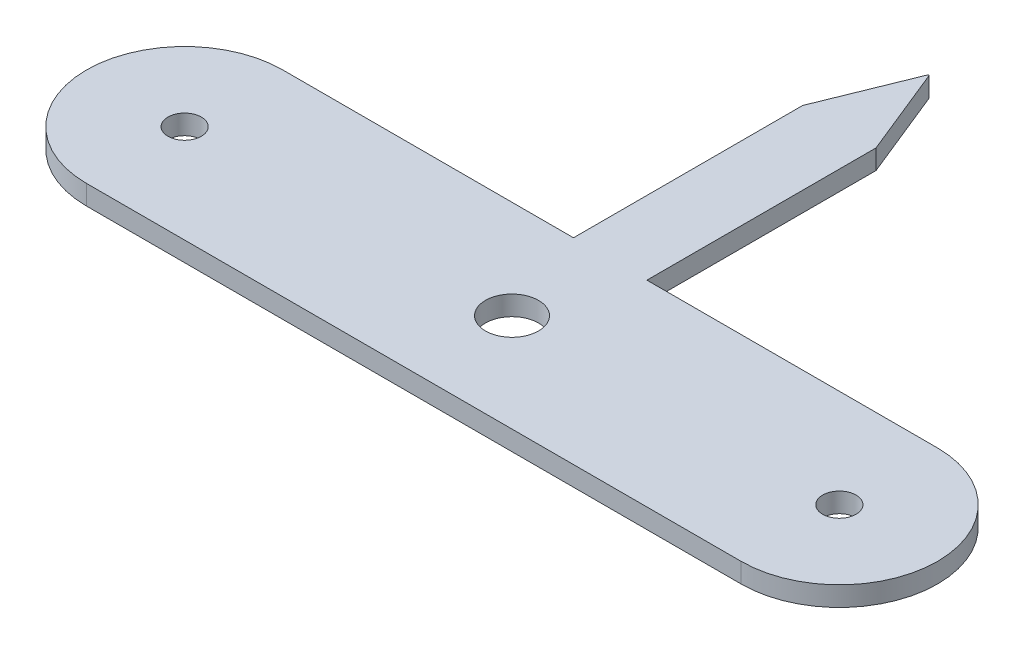
ISO-10303-21;
HEADER;
FILE_DESCRIPTION(('STEP AP214'),'2;1');
FILE_NAME('part.step','',(''),(''),'','','');
FILE_SCHEMA(('AUTOMOTIVE_DESIGN { 1 0 10303 214 1 1 1 1 }'));
ENDSEC;
DATA;
#1=APPLICATION_CONTEXT('core data for automotive mechanical design processes');
#2=APPLICATION_PROTOCOL_DEFINITION('international standard','automotive_design',2000,#1);
#3=PRODUCT_CONTEXT('',#1,'mechanical');
#4=PRODUCT('Part','Part','',(#3));
#5=PRODUCT_RELATED_PRODUCT_CATEGORY('part','',(#4));
#6=PRODUCT_DEFINITION_FORMATION('','',#4);
#7=PRODUCT_DEFINITION_CONTEXT('part definition',#1,'design');
#8=PRODUCT_DEFINITION('design','',#6,#7);
#9=PRODUCT_DEFINITION_SHAPE('','',#8);
#10=(LENGTH_UNIT() NAMED_UNIT(*) SI_UNIT(.MILLI.,.METRE.));
#11=(NAMED_UNIT(*) PLANE_ANGLE_UNIT() SI_UNIT($,.RADIAN.));
#12=(NAMED_UNIT(*) SI_UNIT($,.STERADIAN.) SOLID_ANGLE_UNIT());
#13=UNCERTAINTY_MEASURE_WITH_UNIT(LENGTH_MEASURE(1.E-05),#10,'distance_accuracy_value','');
#14=(GEOMETRIC_REPRESENTATION_CONTEXT(3) GLOBAL_UNCERTAINTY_ASSIGNED_CONTEXT((#13)) GLOBAL_UNIT_ASSIGNED_CONTEXT((#10,
#11,#12)) REPRESENTATION_CONTEXT('',''));
#15=CARTESIAN_POINT('',(0.,0.,0.));
#16=DIRECTION('',(0.,0.,1.));
#17=DIRECTION('',(1.,0.,0.));
#18=AXIS2_PLACEMENT_3D('',#15,#16,#17);
#19=CARTESIAN_POINT('',(50.,3.,0.));
#20=DIRECTION('',(0.,-1.,0.));
#21=DIRECTION('',(0.,0.,-1.));
#22=AXIS2_PLACEMENT_3D('',#19,#20,#21);
#23=CYLINDRICAL_SURFACE('',#22,15.);
#24=CARTESIAN_POINT('',(50.,0.,0.));
#25=DIRECTION('',(0.,1.,0.));
#26=DIRECTION('',(0.,0.,1.));
#27=AXIS2_PLACEMENT_3D('',#24,#25,#26);
#28=CIRCLE('',#27,15.);
#29=CARTESIAN_POINT('',(50.,0.,15.));
#30=VERTEX_POINT('',#29);
#31=CARTESIAN_POINT('',(50.,0.,-15.));
#32=VERTEX_POINT('',#31);
#33=EDGE_CURVE('E135',#30,#32,#28,.T.);
#34=ORIENTED_EDGE('',*,*,#33,.T.);
#35=DIRECTION('',(0.,-1.,0.));
#36=VECTOR('',#35,1.);
#37=CARTESIAN_POINT('',(50.,3.,-15.));
#38=LINE('',#37,#36);
#39=CARTESIAN_POINT('',(50.,3.,-15.));
#40=VERTEX_POINT('',#39);
#41=EDGE_CURVE('E116',#40,#32,#38,.T.);
#42=ORIENTED_EDGE('',*,*,#41,.F.);
#43=CARTESIAN_POINT('',(50.,3.,0.));
#44=DIRECTION('',(0.,1.,0.));
#45=DIRECTION('',(0.,0.,1.));
#46=AXIS2_PLACEMENT_3D('',#43,#44,#45);
#47=CIRCLE('',#46,15.);
#48=CARTESIAN_POINT('',(50.,3.,15.));
#49=VERTEX_POINT('',#48);
#50=EDGE_CURVE('E123',#49,#40,#47,.T.);
#51=ORIENTED_EDGE('',*,*,#50,.F.);
#52=DIRECTION('',(0.,-1.,0.));
#53=VECTOR('',#52,1.);
#54=CARTESIAN_POINT('',(50.,3.,15.));
#55=LINE('',#54,#53);
#56=EDGE_CURVE('E158',#49,#30,#55,.T.);
#57=ORIENTED_EDGE('',*,*,#56,.T.);
#58=EDGE_LOOP('',(#34,#42,#51,#57));
#59=FACE_BOUND('',#58,.T.);
#60=ADVANCED_FACE('F35',(#59),#23,.T.);
#61=CARTESIAN_POINT('',(50.,3.,-15.));
#62=DIRECTION('',(0.,0.,1.));
#63=DIRECTION('',(1.,0.,0.));
#64=AXIS2_PLACEMENT_3D('',#61,#62,#63);
#65=PLANE('',#64);
#66=DIRECTION('',(-1.,0.,0.));
#67=VECTOR('',#66,1.);
#68=CARTESIAN_POINT('',(50.,0.,-15.));
#69=LINE('',#68,#67);
#70=CARTESIAN_POINT('',(5.60663419304319,0.,-15.));
#71=VERTEX_POINT('',#70);
#72=EDGE_CURVE('E173',#32,#71,#69,.T.);
#73=ORIENTED_EDGE('',*,*,#72,.T.);
#74=DIRECTION('',(0.,-1.,0.));
#75=VECTOR('',#74,1.);
#76=CARTESIAN_POINT('',(5.60663419304319,3.,-15.));
#77=LINE('',#76,#75);
#78=CARTESIAN_POINT('',(5.60663419304319,3.,-15.));
#79=VERTEX_POINT('',#78);
#80=EDGE_CURVE('E119',#79,#71,#77,.T.);
#81=ORIENTED_EDGE('',*,*,#80,.F.);
#82=DIRECTION('',(-1.,0.,0.));
#83=VECTOR('',#82,1.);
#84=CARTESIAN_POINT('',(50.,3.,-15.));
#85=LINE('',#84,#83);
#86=EDGE_CURVE('E112',#40,#79,#85,.T.);
#87=ORIENTED_EDGE('',*,*,#86,.F.);
#88=ORIENTED_EDGE('',*,*,#41,.T.);
#89=EDGE_LOOP('',(#73,#81,#87,#88));
#90=FACE_BOUND('',#89,.T.);
#91=ADVANCED_FACE('F114',(#90),#65,.F.);
#92=CARTESIAN_POINT('',(5.60663419304319,3.,-15.));
#93=DIRECTION('',(-1.,0.,0.));
#94=DIRECTION('',(0.,0.,1.));
#95=AXIS2_PLACEMENT_3D('',#92,#93,#94);
#96=PLANE('',#95);
#97=DIRECTION('',(0.,0.,-1.));
#98=VECTOR('',#97,1.);
#99=CARTESIAN_POINT('',(5.60663419304319,0.,-15.));
#100=LINE('',#99,#98);
#101=CARTESIAN_POINT('',(5.6066341930432,0.,-50.));
#102=VERTEX_POINT('',#101);
#103=EDGE_CURVE('E171',#71,#102,#100,.T.);
#104=ORIENTED_EDGE('',*,*,#103,.T.);
#105=DIRECTION('',(0.,-1.,0.));
#106=VECTOR('',#105,1.);
#107=CARTESIAN_POINT('',(5.6066341930432,3.,-50.));
#108=LINE('',#107,#106);
#109=CARTESIAN_POINT('',(5.6066341930432,3.,-50.));
#110=VERTEX_POINT('',#109);
#111=EDGE_CURVE('E140',#110,#102,#108,.T.);
#112=ORIENTED_EDGE('',*,*,#111,.F.);
#113=DIRECTION('',(0.,0.,-1.));
#114=VECTOR('',#113,1.);
#115=CARTESIAN_POINT('',(5.60663419304319,3.,-15.));
#116=LINE('',#115,#114);
#117=EDGE_CURVE('E122',#79,#110,#116,.T.);
#118=ORIENTED_EDGE('',*,*,#117,.F.);
#119=ORIENTED_EDGE('',*,*,#80,.T.);
#120=EDGE_LOOP('',(#104,#112,#118,#119));
#121=FACE_BOUND('',#120,.T.);
#122=ADVANCED_FACE('F239',(#121),#96,.F.);
#123=CARTESIAN_POINT('',(0.,3.,-63.8402420051947));
#124=DIRECTION('',(-0.926838907737354,0.,0.375459237606733));
#125=DIRECTION('',(0.375459237606733,0.,0.926838907737354));
#126=AXIS2_PLACEMENT_3D('',#123,#124,#125);
#127=PLANE('',#126);
#128=DIRECTION('',(-0.375459237606733,0.,-0.926838907737354));
#129=VECTOR('',#128,1.);
#130=CARTESIAN_POINT('',(0.,0.,-63.8402420051947));
#131=LINE('',#130,#129);
#132=CARTESIAN_POINT('',(0.0926838907737477,0.,-63.6114474318153));
#133=VERTEX_POINT('',#132);
#134=EDGE_CURVE('E169',#102,#133,#131,.T.);
#135=ORIENTED_EDGE('',*,*,#134,.T.);
#136=DIRECTION('',(0.,-1.,0.));
#137=VECTOR('',#136,1.);
#138=CARTESIAN_POINT('',(0.092683890773748,3.,-63.6114474318153));
#139=LINE('',#138,#137);
#140=CARTESIAN_POINT('',(0.0926838907737477,3.,-63.6114474318153));
#141=VERTEX_POINT('',#140);
#142=EDGE_CURVE('E43',#133,#141,#139,.F.);
#143=ORIENTED_EDGE('',*,*,#142,.T.);
#144=DIRECTION('',(-0.375459237606733,0.,-0.926838907737354));
#145=VECTOR('',#144,1.);
#146=CARTESIAN_POINT('',(0.,3.,-63.8402420051947));
#147=LINE('',#146,#145);
#148=EDGE_CURVE('E186',#110,#141,#147,.T.);
#149=ORIENTED_EDGE('',*,*,#148,.F.);
#150=ORIENTED_EDGE('',*,*,#111,.T.);
#151=EDGE_LOOP('',(#135,#143,#149,#150));
#152=FACE_BOUND('',#151,.T.);
#153=ADVANCED_FACE('F244',(#152),#127,.F.);
#154=CARTESIAN_POINT('',(-5.60663419304319,3.,-50.));
#155=DIRECTION('',(0.926838907737354,0.,0.375459237606733));
#156=DIRECTION('',(0.375459237606733,0.,-0.926838907737354));
#157=AXIS2_PLACEMENT_3D('',#154,#155,#156);
#158=PLANE('',#157);
#159=DIRECTION('',(-0.375459237606733,0.,0.926838907737354));
#160=VECTOR('',#159,1.);
#161=CARTESIAN_POINT('',(-5.60663419304319,3.,-50.));
#162=LINE('',#161,#160);
#163=CARTESIAN_POINT('',(-0.0926838907737244,3.,-63.6114474318153));
#164=VERTEX_POINT('',#163);
#165=CARTESIAN_POINT('',(-5.60663419304319,3.,-50.));
#166=VERTEX_POINT('',#165);
#167=EDGE_CURVE('E184',#164,#166,#162,.T.);
#168=ORIENTED_EDGE('',*,*,#167,.F.);
#169=DIRECTION('',(0.,-1.,0.));
#170=VECTOR('',#169,1.);
#171=CARTESIAN_POINT('',(-0.0926838907737261,3.,-63.6114474318153));
#172=LINE('',#171,#170);
#173=CARTESIAN_POINT('',(-0.0926838907737244,0.,-63.6114474318153));
#174=VERTEX_POINT('',#173);
#175=EDGE_CURVE('E136',#164,#174,#172,.T.);
#176=ORIENTED_EDGE('',*,*,#175,.T.);
#177=DIRECTION('',(-0.375459237606733,0.,0.926838907737354));
#178=VECTOR('',#177,1.);
#179=CARTESIAN_POINT('',(-5.60663419304319,0.,-50.));
#180=LINE('',#179,#178);
#181=CARTESIAN_POINT('',(-5.60663419304319,0.,-50.));
#182=VERTEX_POINT('',#181);
#183=EDGE_CURVE('E167',#174,#182,#180,.T.);
#184=ORIENTED_EDGE('',*,*,#183,.T.);
#185=DIRECTION('',(0.,-1.,0.));
#186=VECTOR('',#185,1.);
#187=CARTESIAN_POINT('',(-5.60663419304319,3.,-50.));
#188=LINE('',#187,#186);
#189=EDGE_CURVE('E146',#166,#182,#188,.T.);
#190=ORIENTED_EDGE('',*,*,#189,.F.);
#191=EDGE_LOOP('',(#168,#176,#184,#190));
#192=FACE_BOUND('',#191,.T.);
#193=ADVANCED_FACE('F248',(#192),#158,.F.);
#194=CARTESIAN_POINT('',(-5.6066341930432,3.,-15.));
#195=DIRECTION('',(1.,0.,0.));
#196=DIRECTION('',(0.,0.,-1.));
#197=AXIS2_PLACEMENT_3D('',#194,#195,#196);
#198=PLANE('',#197);
#199=DIRECTION('',(0.,0.,1.));
#200=VECTOR('',#199,1.);
#201=CARTESIAN_POINT('',(-5.6066341930432,0.,-15.));
#202=LINE('',#201,#200);
#203=CARTESIAN_POINT('',(-5.6066341930432,0.,-15.));
#204=VERTEX_POINT('',#203);
#205=EDGE_CURVE('E165',#182,#204,#202,.T.);
#206=ORIENTED_EDGE('',*,*,#205,.T.);
#207=DIRECTION('',(0.,-1.,0.));
#208=VECTOR('',#207,1.);
#209=CARTESIAN_POINT('',(-5.6066341930432,3.,-15.));
#210=LINE('',#209,#208);
#211=CARTESIAN_POINT('',(-5.6066341930432,3.,-15.));
#212=VERTEX_POINT('',#211);
#213=EDGE_CURVE('E149',#212,#204,#210,.T.);
#214=ORIENTED_EDGE('',*,*,#213,.F.);
#215=DIRECTION('',(0.,0.,1.));
#216=VECTOR('',#215,1.);
#217=CARTESIAN_POINT('',(-5.6066341930432,3.,-15.));
#218=LINE('',#217,#216);
#219=EDGE_CURVE('E182',#166,#212,#218,.T.);
#220=ORIENTED_EDGE('',*,*,#219,.F.);
#221=ORIENTED_EDGE('',*,*,#189,.T.);
#222=EDGE_LOOP('',(#206,#214,#220,#221));
#223=FACE_BOUND('',#222,.T.);
#224=ADVANCED_FACE('F251',(#223),#198,.F.);
#225=CARTESIAN_POINT('',(-5.6066341930432,3.,-15.));
#226=DIRECTION('',(0.,0.,1.));
#227=DIRECTION('',(1.,0.,0.));
#228=AXIS2_PLACEMENT_3D('',#225,#226,#227);
#229=PLANE('',#228);
#230=DIRECTION('',(-1.,0.,0.));
#231=VECTOR('',#230,1.);
#232=CARTESIAN_POINT('',(-5.6066341930432,0.,-15.));
#233=LINE('',#232,#231);
#234=CARTESIAN_POINT('',(-50.,0.,-15.));
#235=VERTEX_POINT('',#234);
#236=EDGE_CURVE('E163',#204,#235,#233,.T.);
#237=ORIENTED_EDGE('',*,*,#236,.T.);
#238=DIRECTION('',(0.,-1.,0.));
#239=VECTOR('',#238,1.);
#240=CARTESIAN_POINT('',(-50.,3.,-15.));
#241=LINE('',#240,#239);
#242=CARTESIAN_POINT('',(-50.,3.,-15.));
#243=VERTEX_POINT('',#242);
#244=EDGE_CURVE('E152',#243,#235,#241,.T.);
#245=ORIENTED_EDGE('',*,*,#244,.F.);
#246=DIRECTION('',(-1.,0.,0.));
#247=VECTOR('',#246,1.);
#248=CARTESIAN_POINT('',(-5.6066341930432,3.,-15.));
#249=LINE('',#248,#247);
#250=EDGE_CURVE('E180',#212,#243,#249,.T.);
#251=ORIENTED_EDGE('',*,*,#250,.F.);
#252=ORIENTED_EDGE('',*,*,#213,.T.);
#253=EDGE_LOOP('',(#237,#245,#251,#252));
#254=FACE_BOUND('',#253,.T.);
#255=ADVANCED_FACE('F255',(#254),#229,.F.);
#256=CARTESIAN_POINT('',(-50.,3.,0.));
#257=DIRECTION('',(0.,-1.,0.));
#258=DIRECTION('',(0.,0.,-1.));
#259=AXIS2_PLACEMENT_3D('',#256,#257,#258);
#260=CYLINDRICAL_SURFACE('',#259,15.);
#261=CARTESIAN_POINT('',(-50.,0.,0.));
#262=DIRECTION('',(0.,1.,0.));
#263=DIRECTION('',(0.,0.,1.));
#264=AXIS2_PLACEMENT_3D('',#261,#262,#263);
#265=CIRCLE('',#264,15.);
#266=CARTESIAN_POINT('',(-50.,0.,15.));
#267=VERTEX_POINT('',#266);
#268=EDGE_CURVE('E161',#235,#267,#265,.T.);
#269=ORIENTED_EDGE('',*,*,#268,.T.);
#270=DIRECTION('',(0.,-1.,0.));
#271=VECTOR('',#270,1.);
#272=CARTESIAN_POINT('',(-50.,3.,15.));
#273=LINE('',#272,#271);
#274=CARTESIAN_POINT('',(-50.,3.,15.));
#275=VERTEX_POINT('',#274);
#276=EDGE_CURVE('E155',#275,#267,#273,.T.);
#277=ORIENTED_EDGE('',*,*,#276,.F.);
#278=CARTESIAN_POINT('',(-50.,3.,0.));
#279=DIRECTION('',(0.,1.,0.));
#280=DIRECTION('',(0.,0.,1.));
#281=AXIS2_PLACEMENT_3D('',#278,#279,#280);
#282=CIRCLE('',#281,15.);
#283=EDGE_CURVE('E178',#243,#275,#282,.T.);
#284=ORIENTED_EDGE('',*,*,#283,.F.);
#285=ORIENTED_EDGE('',*,*,#244,.T.);
#286=EDGE_LOOP('',(#269,#277,#284,#285));
#287=FACE_BOUND('',#286,.T.);
#288=ADVANCED_FACE('F259',(#287),#260,.T.);
#289=CARTESIAN_POINT('',(50.,3.,15.));
#290=DIRECTION('',(0.,0.,-1.));
#291=DIRECTION('',(-1.,0.,0.));
#292=AXIS2_PLACEMENT_3D('',#289,#290,#291);
#293=PLANE('',#292);
#294=DIRECTION('',(1.,0.,0.));
#295=VECTOR('',#294,1.);
#296=CARTESIAN_POINT('',(50.,0.,15.));
#297=LINE('',#296,#295);
#298=EDGE_CURVE('E132',#267,#30,#297,.T.);
#299=ORIENTED_EDGE('',*,*,#298,.T.);
#300=ORIENTED_EDGE('',*,*,#56,.F.);
#301=DIRECTION('',(1.,0.,0.));
#302=VECTOR('',#301,1.);
#303=CARTESIAN_POINT('',(50.,3.,15.));
#304=LINE('',#303,#302);
#305=EDGE_CURVE('E128',#275,#49,#304,.T.);
#306=ORIENTED_EDGE('',*,*,#305,.F.);
#307=ORIENTED_EDGE('',*,*,#276,.T.);
#308=EDGE_LOOP('',(#299,#300,#306,#307));
#309=FACE_BOUND('',#308,.T.);
#310=ADVANCED_FACE('F220',(#309),#293,.F.);
#311=CARTESIAN_POINT('',(50.,3.,0.));
#312=DIRECTION('',(0.,1.,0.));
#313=DIRECTION('',(0.,0.,1.));
#314=AXIS2_PLACEMENT_3D('',#311,#312,#313);
#315=PLANE('',#314);
#316=CARTESIAN_POINT('',(50.,3.,0.));
#317=DIRECTION('',(0.,1.,0.));
#318=DIRECTION('',(0.,0.,-1.));
#319=AXIS2_PLACEMENT_3D('',#316,#317,#318);
#320=CIRCLE('',#319,2.55);
#321=CARTESIAN_POINT('',(50.,3.,-2.54999999999999));
#322=VERTEX_POINT('',#321);
#323=EDGE_CURVE('E195',#322,#322,#320,.T.);
#324=ORIENTED_EDGE('',*,*,#323,.F.);
#325=EDGE_LOOP('',(#324));
#326=FACE_BOUND('',#325,.T.);
#327=CARTESIAN_POINT('',(-50.,3.,0.));
#328=DIRECTION('',(0.,1.,0.));
#329=DIRECTION('',(0.,0.,1.));
#330=AXIS2_PLACEMENT_3D('',#327,#328,#329);
#331=CIRCLE('',#330,2.55);
#332=CARTESIAN_POINT('',(-50.,3.,2.55000000000001));
#333=VERTEX_POINT('',#332);
#334=EDGE_CURVE('E201',#333,#333,#331,.T.);
#335=ORIENTED_EDGE('',*,*,#334,.F.);
#336=EDGE_LOOP('',(#335));
#337=FACE_BOUND('',#336,.T.);
#338=CARTESIAN_POINT('',(0.,3.,0.));
#339=DIRECTION('',(0.,1.,0.));
#340=DIRECTION('',(0.,0.,1.));
#341=AXIS2_PLACEMENT_3D('',#338,#339,#340);
#342=CIRCLE('',#341,4.05);
#343=CARTESIAN_POINT('',(0.,3.,4.05));
#344=VERTEX_POINT('',#343);
#345=EDGE_CURVE('E189',#344,#344,#342,.T.);
#346=ORIENTED_EDGE('',*,*,#345,.F.);
#347=EDGE_LOOP('',(#346));
#348=FACE_BOUND('',#347,.T.);
#349=ORIENTED_EDGE('',*,*,#148,.T.);
#350=CARTESIAN_POINT('',(0.,3.,-63.5739015080546));
#351=DIRECTION('',(0.,1.,0.));
#352=DIRECTION('',(0.,0.,1.));
#353=AXIS2_PLACEMENT_3D('',#350,#351,#352);
#354=CIRCLE('',#353,0.1);
#355=EDGE_CURVE('E11',#141,#164,#354,.T.);
#356=ORIENTED_EDGE('',*,*,#355,.T.);
#357=ORIENTED_EDGE('',*,*,#167,.T.);
#358=ORIENTED_EDGE('',*,*,#219,.T.);
#359=ORIENTED_EDGE('',*,*,#250,.T.);
#360=ORIENTED_EDGE('',*,*,#283,.T.);
#361=ORIENTED_EDGE('',*,*,#305,.T.);
#362=ORIENTED_EDGE('',*,*,#50,.T.);
#363=ORIENTED_EDGE('',*,*,#86,.T.);
#364=ORIENTED_EDGE('',*,*,#117,.T.);
#365=EDGE_LOOP('',(#349,#356,#357,#358,#359,#360,#361,#362,#363,#364));
#366=FACE_BOUND('',#365,.T.);
#367=ADVANCED_FACE('F126',(#326,#337,#348,#366),#315,.T.);
#368=CARTESIAN_POINT('',(50.,0.,0.));
#369=DIRECTION('',(0.,1.,0.));
#370=DIRECTION('',(0.,0.,1.));
#371=AXIS2_PLACEMENT_3D('',#368,#369,#370);
#372=PLANE('',#371);
#373=CARTESIAN_POINT('',(50.,0.,0.));
#374=DIRECTION('',(0.,1.,0.));
#375=DIRECTION('',(0.,0.,-1.));
#376=AXIS2_PLACEMENT_3D('',#373,#374,#375);
#377=CIRCLE('',#376,2.55);
#378=CARTESIAN_POINT('',(50.,0.,-2.54999999999999));
#379=VERTEX_POINT('',#378);
#380=EDGE_CURVE('E198',#379,#379,#377,.T.);
#381=ORIENTED_EDGE('',*,*,#380,.T.);
#382=EDGE_LOOP('',(#381));
#383=FACE_BOUND('',#382,.T.);
#384=CARTESIAN_POINT('',(-50.,0.,0.));
#385=DIRECTION('',(0.,1.,0.));
#386=DIRECTION('',(0.,0.,1.));
#387=AXIS2_PLACEMENT_3D('',#384,#385,#386);
#388=CIRCLE('',#387,2.55);
#389=CARTESIAN_POINT('',(-50.,0.,2.55000000000001));
#390=VERTEX_POINT('',#389);
#391=EDGE_CURVE('E192',#390,#390,#388,.T.);
#392=ORIENTED_EDGE('',*,*,#391,.T.);
#393=EDGE_LOOP('',(#392));
#394=FACE_BOUND('',#393,.T.);
#395=CARTESIAN_POINT('',(0.,0.,0.));
#396=DIRECTION('',(0.,1.,0.));
#397=DIRECTION('',(0.,0.,1.));
#398=AXIS2_PLACEMENT_3D('',#395,#396,#397);
#399=CIRCLE('',#398,4.05);
#400=CARTESIAN_POINT('',(0.,0.,4.05));
#401=VERTEX_POINT('',#400);
#402=EDGE_CURVE('E176',#401,#401,#399,.T.);
#403=ORIENTED_EDGE('',*,*,#402,.T.);
#404=EDGE_LOOP('',(#403));
#405=FACE_BOUND('',#404,.T.);
#406=ORIENTED_EDGE('',*,*,#183,.F.);
#407=CARTESIAN_POINT('',(0.,0.,-63.5739015080546));
#408=DIRECTION('',(0.,1.,0.));
#409=DIRECTION('',(0.,0.,1.));
#410=AXIS2_PLACEMENT_3D('',#407,#408,#409);
#411=CIRCLE('',#410,0.1);
#412=EDGE_CURVE('E57',#174,#133,#411,.F.);
#413=ORIENTED_EDGE('',*,*,#412,.T.);
#414=ORIENTED_EDGE('',*,*,#134,.F.);
#415=ORIENTED_EDGE('',*,*,#103,.F.);
#416=ORIENTED_EDGE('',*,*,#72,.F.);
#417=ORIENTED_EDGE('',*,*,#33,.F.);
#418=ORIENTED_EDGE('',*,*,#298,.F.);
#419=ORIENTED_EDGE('',*,*,#268,.F.);
#420=ORIENTED_EDGE('',*,*,#236,.F.);
#421=ORIENTED_EDGE('',*,*,#205,.F.);
#422=EDGE_LOOP('',(#406,#413,#414,#415,#416,#417,#418,#419,#420,#421));
#423=FACE_BOUND('',#422,.T.);
#424=ADVANCED_FACE('F207',(#383,#394,#405,#423),#372,.F.);
#425=CARTESIAN_POINT('',(0.,0.,0.));
#426=DIRECTION('',(0.,1.,0.));
#427=DIRECTION('',(0.,0.,1.));
#428=AXIS2_PLACEMENT_3D('',#425,#426,#427);
#429=CYLINDRICAL_SURFACE('',#428,4.05);
#430=ORIENTED_EDGE('',*,*,#402,.F.);
#431=EDGE_LOOP('',(#430));
#432=FACE_BOUND('',#431,.T.);
#433=ORIENTED_EDGE('',*,*,#345,.T.);
#434=EDGE_LOOP('',(#433));
#435=FACE_BOUND('',#434,.T.);
#436=ADVANCED_FACE('F214',(#432,#435),#429,.F.);
#437=CARTESIAN_POINT('',(-50.,0.,0.));
#438=DIRECTION('',(0.,1.,0.));
#439=DIRECTION('',(0.,0.,1.));
#440=AXIS2_PLACEMENT_3D('',#437,#438,#439);
#441=CYLINDRICAL_SURFACE('',#440,2.55);
#442=ORIENTED_EDGE('',*,*,#391,.F.);
#443=EDGE_LOOP('',(#442));
#444=FACE_BOUND('',#443,.T.);
#445=ORIENTED_EDGE('',*,*,#334,.T.);
#446=EDGE_LOOP('',(#445));
#447=FACE_BOUND('',#446,.T.);
#448=ADVANCED_FACE('F210',(#444,#447),#441,.F.);
#449=CARTESIAN_POINT('',(50.,0.,0.));
#450=DIRECTION('',(0.,1.,0.));
#451=DIRECTION('',(0.,0.,1.));
#452=AXIS2_PLACEMENT_3D('',#449,#450,#451);
#453=CYLINDRICAL_SURFACE('',#452,2.55);
#454=ORIENTED_EDGE('',*,*,#380,.F.);
#455=EDGE_LOOP('',(#454));
#456=FACE_BOUND('',#455,.T.);
#457=ORIENTED_EDGE('',*,*,#323,.T.);
#458=EDGE_LOOP('',(#457));
#459=FACE_BOUND('',#458,.T.);
#460=ADVANCED_FACE('F213',(#456,#459),#453,.F.);
#461=CARTESIAN_POINT('',(0.,3.,-63.5739015080546));
#462=DIRECTION('',(0.,-1.,0.));
#463=DIRECTION('',(0.,0.,-1.));
#464=AXIS2_PLACEMENT_3D('',#461,#462,#463);
#465=CYLINDRICAL_SURFACE('',#464,0.1);
#466=ORIENTED_EDGE('',*,*,#355,.F.);
#467=ORIENTED_EDGE('',*,*,#142,.F.);
#468=ORIENTED_EDGE('',*,*,#412,.F.);
#469=ORIENTED_EDGE('',*,*,#175,.F.);
#470=EDGE_LOOP('',(#466,#467,#468,#469));
#471=FACE_BOUND('',#470,.T.);
#472=ADVANCED_FACE('F37',(#471),#465,.T.);
#473=CLOSED_SHELL('',(#60,#91,#122,#153,#193,#224,#255,#288,#310,#367,#424,#436,#448,#460,#472));
#474=MANIFOLD_SOLID_BREP('B2',#473);
#475=ADVANCED_BREP_SHAPE_REPRESENTATION('',(#18,#474),#14);
#476=SHAPE_DEFINITION_REPRESENTATION(#9,#475);
ENDSEC;
END-ISO-10303-21;
